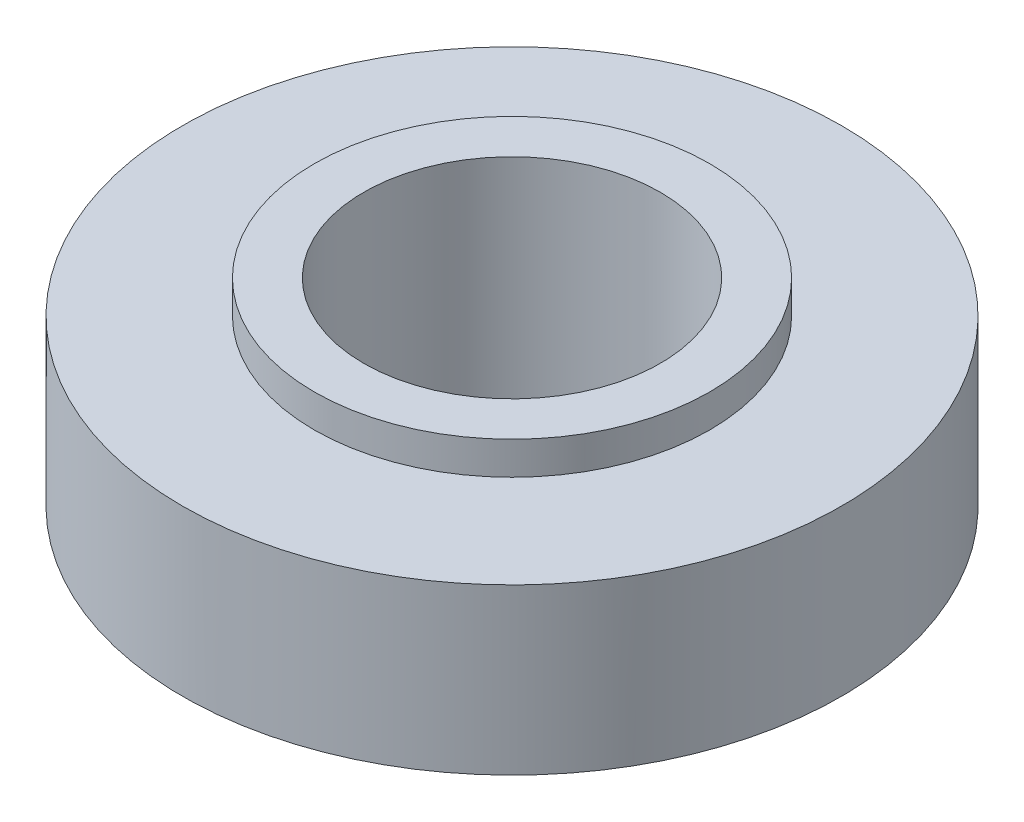
ISO-10303-21;
HEADER;
FILE_DESCRIPTION(('STEP AP214'),'2;1');
FILE_NAME('part.step','',(''),(''),'','','');
FILE_SCHEMA(('AUTOMOTIVE_DESIGN { 1 0 10303 214 1 1 1 1 }'));
ENDSEC;
DATA;
#1=APPLICATION_CONTEXT('core data for automotive mechanical design processes');
#2=APPLICATION_PROTOCOL_DEFINITION('international standard','automotive_design',2000,#1);
#3=PRODUCT_CONTEXT('',#1,'mechanical');
#4=PRODUCT('Part','Part','',(#3));
#5=PRODUCT_RELATED_PRODUCT_CATEGORY('part','',(#4));
#6=PRODUCT_DEFINITION_FORMATION('','',#4);
#7=PRODUCT_DEFINITION_CONTEXT('part definition',#1,'design');
#8=PRODUCT_DEFINITION('design','',#6,#7);
#9=PRODUCT_DEFINITION_SHAPE('','',#8);
#10=(LENGTH_UNIT() NAMED_UNIT(*) SI_UNIT(.MILLI.,.METRE.));
#11=(NAMED_UNIT(*) PLANE_ANGLE_UNIT() SI_UNIT($,.RADIAN.));
#12=(NAMED_UNIT(*) SI_UNIT($,.STERADIAN.) SOLID_ANGLE_UNIT());
#13=UNCERTAINTY_MEASURE_WITH_UNIT(LENGTH_MEASURE(1.E-05),#10,'distance_accuracy_value','');
#14=(GEOMETRIC_REPRESENTATION_CONTEXT(3) GLOBAL_UNCERTAINTY_ASSIGNED_CONTEXT((#13)) GLOBAL_UNIT_ASSIGNED_CONTEXT((#10,
#11,#12)) REPRESENTATION_CONTEXT('',''));
#15=CARTESIAN_POINT('',(0.,0.,0.));
#16=DIRECTION('',(0.,0.,1.));
#17=DIRECTION('',(1.,0.,0.));
#18=AXIS2_PLACEMENT_3D('',#15,#16,#17);
#19=CARTESIAN_POINT('',(0.,3.5,0.));
#20=DIRECTION('',(0.,-1.,0.));
#21=DIRECTION('',(0.,0.,-1.));
#22=AXIS2_PLACEMENT_3D('',#19,#20,#21);
#23=CYLINDRICAL_SURFACE('',#22,10.);
#24=CARTESIAN_POINT('',(0.,2.5,0.));
#25=DIRECTION('',(0.,1.,0.));
#26=DIRECTION('',(0.,0.,1.));
#27=AXIS2_PLACEMENT_3D('',#24,#25,#26);
#28=CIRCLE('',#27,10.);
#29=CARTESIAN_POINT('',(0.,2.5,10.));
#30=VERTEX_POINT('',#29);
#31=EDGE_CURVE('E53',#30,#30,#28,.T.);
#32=ORIENTED_EDGE('',*,*,#31,.F.);
#33=EDGE_LOOP('',(#32));
#34=FACE_BOUND('',#33,.T.);
#35=CARTESIAN_POINT('',(0.,-2.5,0.));
#36=DIRECTION('',(0.,-1.,0.));
#37=DIRECTION('',(0.,0.,-1.));
#38=AXIS2_PLACEMENT_3D('',#35,#36,#37);
#39=CIRCLE('',#38,10.);
#40=CARTESIAN_POINT('',(0.,-2.5,-10.));
#41=VERTEX_POINT('',#40);
#42=EDGE_CURVE('E42',#41,#41,#39,.T.);
#43=ORIENTED_EDGE('',*,*,#42,.F.);
#44=EDGE_LOOP('',(#43));
#45=FACE_BOUND('',#44,.T.);
#46=ADVANCED_FACE('F39',(#34,#45),#23,.T.);
#47=CARTESIAN_POINT('',(0.,-3.5,0.));
#48=DIRECTION('',(0.,1.,0.));
#49=DIRECTION('',(0.,0.,1.));
#50=AXIS2_PLACEMENT_3D('',#47,#48,#49);
#51=PLANE('',#50);
#52=CARTESIAN_POINT('',(0.,-3.5,0.));
#53=DIRECTION('',(0.,1.,0.));
#54=DIRECTION('',(0.,0.,1.));
#55=AXIS2_PLACEMENT_3D('',#52,#53,#54);
#56=CIRCLE('',#55,4.5);
#57=CARTESIAN_POINT('',(0.,-3.5,4.5));
#58=VERTEX_POINT('',#57);
#59=EDGE_CURVE('E47',#58,#58,#56,.T.);
#60=ORIENTED_EDGE('',*,*,#59,.T.);
#61=EDGE_LOOP('',(#60));
#62=FACE_BOUND('',#61,.T.);
#63=CARTESIAN_POINT('',(0.,-3.5,0.));
#64=DIRECTION('',(0.,1.,0.));
#65=DIRECTION('',(0.,0.,1.));
#66=AXIS2_PLACEMENT_3D('',#63,#64,#65);
#67=CIRCLE('',#66,6.);
#68=CARTESIAN_POINT('',(0.,-3.5,6.));
#69=VERTEX_POINT('',#68);
#70=EDGE_CURVE('E70',#69,#69,#67,.T.);
#71=ORIENTED_EDGE('',*,*,#70,.F.);
#72=EDGE_LOOP('',(#71));
#73=FACE_BOUND('',#72,.T.);
#74=ADVANCED_FACE('F86',(#62,#73),#51,.F.);
#75=CARTESIAN_POINT('',(0.,3.5,0.));
#76=DIRECTION('',(0.,1.,0.));
#77=DIRECTION('',(0.,0.,1.));
#78=AXIS2_PLACEMENT_3D('',#75,#76,#77);
#79=PLANE('',#78);
#80=CARTESIAN_POINT('',(0.,3.5,0.));
#81=DIRECTION('',(0.,1.,0.));
#82=DIRECTION('',(0.,0.,1.));
#83=AXIS2_PLACEMENT_3D('',#80,#81,#82);
#84=CIRCLE('',#83,4.5);
#85=CARTESIAN_POINT('',(0.,3.5,4.5));
#86=VERTEX_POINT('',#85);
#87=EDGE_CURVE('E10',#86,#86,#84,.T.);
#88=ORIENTED_EDGE('',*,*,#87,.F.);
#89=EDGE_LOOP('',(#88));
#90=FACE_BOUND('',#89,.T.);
#91=CARTESIAN_POINT('',(0.,3.5,0.));
#92=DIRECTION('',(0.,1.,0.));
#93=DIRECTION('',(0.,0.,1.));
#94=AXIS2_PLACEMENT_3D('',#91,#92,#93);
#95=CIRCLE('',#94,6.);
#96=CARTESIAN_POINT('',(0.,3.5,6.));
#97=VERTEX_POINT('',#96);
#98=EDGE_CURVE('E56',#97,#97,#95,.T.);
#99=ORIENTED_EDGE('',*,*,#98,.T.);
#100=EDGE_LOOP('',(#99));
#101=FACE_BOUND('',#100,.T.);
#102=ADVANCED_FACE('F91',(#90,#101),#79,.T.);
#103=CARTESIAN_POINT('',(0.,3.5,0.));
#104=DIRECTION('',(0.,-1.,0.));
#105=DIRECTION('',(0.,0.,-1.));
#106=AXIS2_PLACEMENT_3D('',#103,#104,#105);
#107=CYLINDRICAL_SURFACE('',#106,4.5);
#108=ORIENTED_EDGE('',*,*,#87,.T.);
#109=EDGE_LOOP('',(#108));
#110=FACE_BOUND('',#109,.T.);
#111=ORIENTED_EDGE('',*,*,#59,.F.);
#112=EDGE_LOOP('',(#111));
#113=FACE_BOUND('',#112,.T.);
#114=ADVANCED_FACE('F96',(#110,#113),#107,.F.);
#115=CARTESIAN_POINT('',(0.,2.5,0.));
#116=DIRECTION('',(0.,1.,0.));
#117=DIRECTION('',(0.,0.,1.));
#118=AXIS2_PLACEMENT_3D('',#115,#116,#117);
#119=PLANE('',#118);
#120=CARTESIAN_POINT('',(0.,2.5,0.));
#121=DIRECTION('',(0.,1.,0.));
#122=DIRECTION('',(0.,0.,1.));
#123=AXIS2_PLACEMENT_3D('',#120,#121,#122);
#124=CIRCLE('',#123,6.);
#125=CARTESIAN_POINT('',(0.,2.5,6.));
#126=VERTEX_POINT('',#125);
#127=EDGE_CURVE('E60',#126,#126,#124,.T.);
#128=ORIENTED_EDGE('',*,*,#127,.F.);
#129=EDGE_LOOP('',(#128));
#130=FACE_BOUND('',#129,.T.);
#131=ORIENTED_EDGE('',*,*,#31,.T.);
#132=EDGE_LOOP('',(#131));
#133=FACE_BOUND('',#132,.T.);
#134=ADVANCED_FACE('F103',(#130,#133),#119,.T.);
#135=CARTESIAN_POINT('',(0.,2.5,0.));
#136=DIRECTION('',(0.,1.,0.));
#137=DIRECTION('',(0.,0.,1.));
#138=AXIS2_PLACEMENT_3D('',#135,#136,#137);
#139=CYLINDRICAL_SURFACE('',#138,6.);
#140=ORIENTED_EDGE('',*,*,#127,.T.);
#141=EDGE_LOOP('',(#140));
#142=FACE_BOUND('',#141,.T.);
#143=ORIENTED_EDGE('',*,*,#98,.F.);
#144=EDGE_LOOP('',(#143));
#145=FACE_BOUND('',#144,.T.);
#146=ADVANCED_FACE('F106',(#142,#145),#139,.T.);
#147=CARTESIAN_POINT('',(0.,-2.5,0.));
#148=DIRECTION('',(0.,-1.,0.));
#149=DIRECTION('',(0.,0.,1.));
#150=AXIS2_PLACEMENT_3D('',#147,#148,#149);
#151=PLANE('',#150);
#152=CARTESIAN_POINT('',(0.,-2.5,0.));
#153=DIRECTION('',(0.,1.,0.));
#154=DIRECTION('',(0.,0.,1.));
#155=AXIS2_PLACEMENT_3D('',#152,#153,#154);
#156=CIRCLE('',#155,6.);
#157=CARTESIAN_POINT('',(0.,-2.5,6.));
#158=VERTEX_POINT('',#157);
#159=EDGE_CURVE('E74',#158,#158,#156,.T.);
#160=ORIENTED_EDGE('',*,*,#159,.T.);
#161=EDGE_LOOP('',(#160));
#162=FACE_BOUND('',#161,.T.);
#163=ORIENTED_EDGE('',*,*,#42,.T.);
#164=EDGE_LOOP('',(#163));
#165=FACE_BOUND('',#164,.T.);
#166=ADVANCED_FACE('F83',(#162,#165),#151,.T.);
#167=CARTESIAN_POINT('',(0.,-2.5,0.));
#168=DIRECTION('',(0.,-1.,0.));
#169=DIRECTION('',(0.,0.,-1.));
#170=AXIS2_PLACEMENT_3D('',#167,#168,#169);
#171=CYLINDRICAL_SURFACE('',#170,6.);
#172=ORIENTED_EDGE('',*,*,#159,.F.);
#173=EDGE_LOOP('',(#172));
#174=FACE_BOUND('',#173,.T.);
#175=ORIENTED_EDGE('',*,*,#70,.T.);
#176=EDGE_LOOP('',(#175));
#177=FACE_BOUND('',#176,.T.);
#178=ADVANCED_FACE('F112',(#174,#177),#171,.T.);
#179=CLOSED_SHELL('',(#46,#74,#102,#114,#134,#146,#166,#178));
#180=MANIFOLD_SOLID_BREP('B2',#179);
#181=ADVANCED_BREP_SHAPE_REPRESENTATION('',(#18,#180),#14);
#182=SHAPE_DEFINITION_REPRESENTATION(#9,#181);
ENDSEC;
END-ISO-10303-21;
